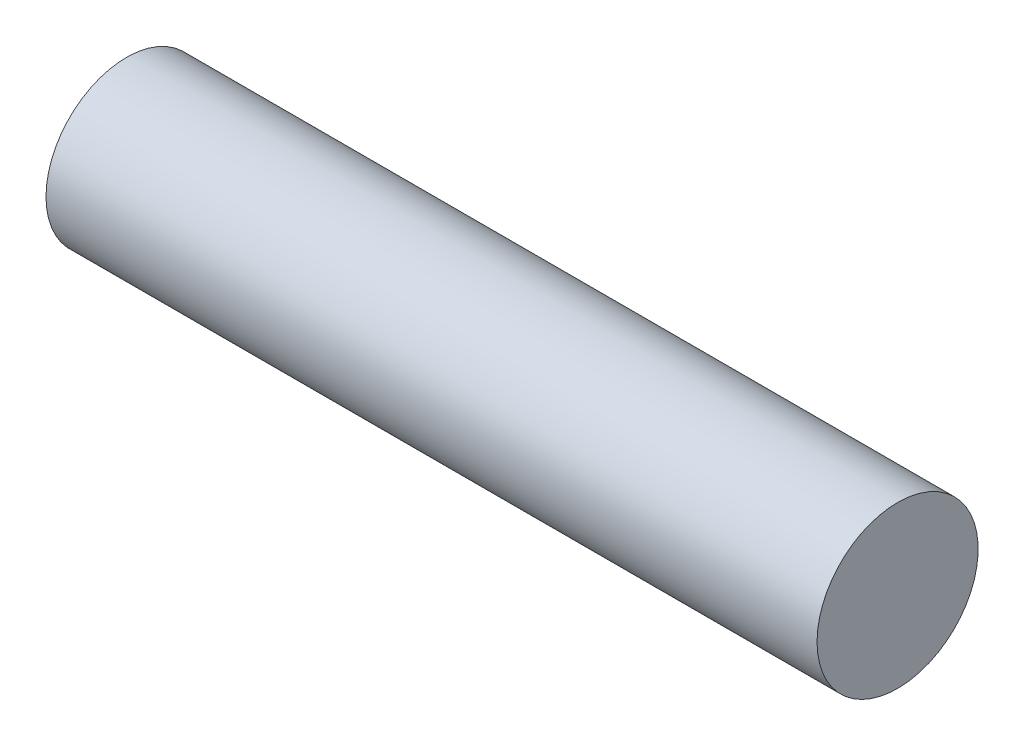
ISO-10303-21;
HEADER;
FILE_DESCRIPTION(('STEP AP214'),'2;1');
FILE_NAME('part.step','',(''),(''),'','','');
FILE_SCHEMA(('AUTOMOTIVE_DESIGN { 1 0 10303 214 1 1 1 1 }'));
ENDSEC;
DATA;
#1=APPLICATION_CONTEXT('core data for automotive mechanical design processes');
#2=APPLICATION_PROTOCOL_DEFINITION('international standard','automotive_design',2000,#1);
#3=PRODUCT_CONTEXT('',#1,'mechanical');
#4=PRODUCT('Part','Part','',(#3));
#5=PRODUCT_RELATED_PRODUCT_CATEGORY('part','',(#4));
#6=PRODUCT_DEFINITION_FORMATION('','',#4);
#7=PRODUCT_DEFINITION_CONTEXT('part definition',#1,'design');
#8=PRODUCT_DEFINITION('design','',#6,#7);
#9=PRODUCT_DEFINITION_SHAPE('','',#8);
#10=(LENGTH_UNIT() NAMED_UNIT(*) SI_UNIT(.MILLI.,.METRE.));
#11=(NAMED_UNIT(*) PLANE_ANGLE_UNIT() SI_UNIT($,.RADIAN.));
#12=(NAMED_UNIT(*) SI_UNIT($,.STERADIAN.) SOLID_ANGLE_UNIT());
#13=UNCERTAINTY_MEASURE_WITH_UNIT(LENGTH_MEASURE(1.E-05),#10,'distance_accuracy_value','');
#14=(GEOMETRIC_REPRESENTATION_CONTEXT(3) GLOBAL_UNCERTAINTY_ASSIGNED_CONTEXT((#13)) GLOBAL_UNIT_ASSIGNED_CONTEXT((#10,
#11,#12)) REPRESENTATION_CONTEXT('',''));
#15=CARTESIAN_POINT('',(0.,0.,0.));
#16=DIRECTION('',(0.,0.,1.));
#17=DIRECTION('',(1.,0.,0.));
#18=AXIS2_PLACEMENT_3D('',#15,#16,#17);
#19=CARTESIAN_POINT('',(33.5,0.,7.));
#20=DIRECTION('',(1.,0.,0.));
#21=DIRECTION('',(0.,0.,-1.));
#22=AXIS2_PLACEMENT_3D('',#19,#20,#21);
#23=PLANE('',#22);
#24=CARTESIAN_POINT('',(33.5,0.,0.));
#25=DIRECTION('',(-1.,0.,0.));
#26=DIRECTION('',(0.,0.,1.));
#27=AXIS2_PLACEMENT_3D('',#24,#25,#26);
#28=CIRCLE('',#27,7.);
#29=CARTESIAN_POINT('',(33.5,0.,7.));
#30=VERTEX_POINT('',#29);
#31=EDGE_CURVE('E10',#30,#30,#28,.T.);
#32=ORIENTED_EDGE('',*,*,#31,.F.);
#33=EDGE_LOOP('',(#32));
#34=FACE_BOUND('',#33,.T.);
#35=ADVANCED_FACE('F30',(#34),#23,.T.);
#36=CARTESIAN_POINT('',(-33.5,0.,0.));
#37=DIRECTION('',(-1.,0.,0.));
#38=DIRECTION('',(0.,0.,1.));
#39=AXIS2_PLACEMENT_3D('',#36,#37,#38);
#40=CYLINDRICAL_SURFACE('',#39,7.);
#41=ORIENTED_EDGE('',*,*,#31,.T.);
#42=EDGE_LOOP('',(#41));
#43=FACE_BOUND('',#42,.T.);
#44=CARTESIAN_POINT('',(-33.5,0.,0.));
#45=DIRECTION('',(-1.,0.,0.));
#46=DIRECTION('',(0.,0.,1.));
#47=AXIS2_PLACEMENT_3D('',#44,#45,#46);
#48=CIRCLE('',#47,7.);
#49=CARTESIAN_POINT('',(-33.5,0.,7.));
#50=VERTEX_POINT('',#49);
#51=EDGE_CURVE('E36',#50,#50,#48,.T.);
#52=ORIENTED_EDGE('',*,*,#51,.F.);
#53=EDGE_LOOP('',(#52));
#54=FACE_BOUND('',#53,.T.);
#55=ADVANCED_FACE('F44',(#43,#54),#40,.T.);
#56=CARTESIAN_POINT('',(-33.5,0.,7.));
#57=DIRECTION('',(-1.,0.,0.));
#58=DIRECTION('',(0.,0.,1.));
#59=AXIS2_PLACEMENT_3D('',#56,#57,#58);
#60=PLANE('',#59);
#61=ORIENTED_EDGE('',*,*,#51,.T.);
#62=EDGE_LOOP('',(#61));
#63=FACE_BOUND('',#62,.T.);
#64=ADVANCED_FACE('F42',(#63),#60,.T.);
#65=CLOSED_SHELL('',(#35,#55,#64));
#66=MANIFOLD_SOLID_BREP('B2',#65);
#67=ADVANCED_BREP_SHAPE_REPRESENTATION('',(#18,#66),#14);
#68=SHAPE_DEFINITION_REPRESENTATION(#9,#67);
ENDSEC;
END-ISO-10303-21;
